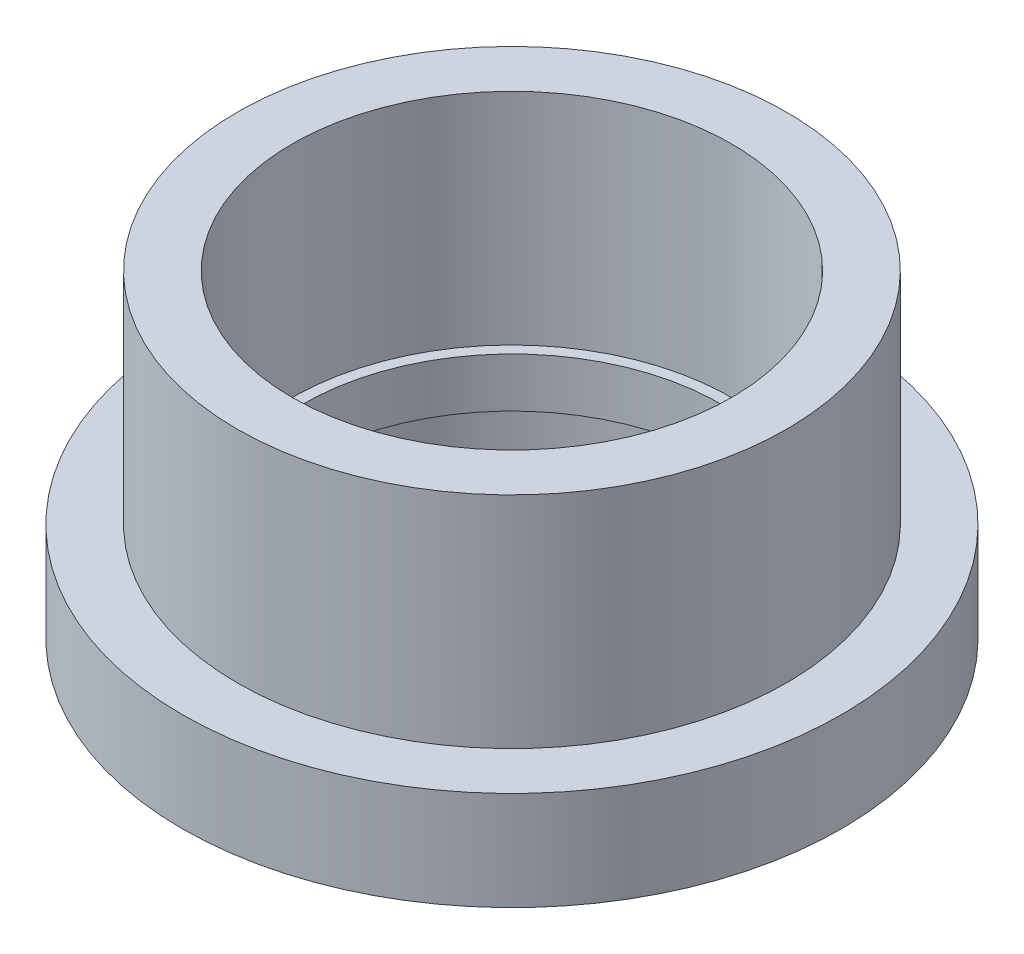
ISO-10303-21;
HEADER;
FILE_DESCRIPTION(('STEP AP214'),'2;1');
FILE_NAME('part.step','',(''),(''),'','','');
FILE_SCHEMA(('AUTOMOTIVE_DESIGN { 1 0 10303 214 1 1 1 1 }'));
ENDSEC;
DATA;
#1=APPLICATION_CONTEXT('core data for automotive mechanical design processes');
#2=APPLICATION_PROTOCOL_DEFINITION('international standard','automotive_design',2000,#1);
#3=PRODUCT_CONTEXT('',#1,'mechanical');
#4=PRODUCT('Part','Part','',(#3));
#5=PRODUCT_RELATED_PRODUCT_CATEGORY('part','',(#4));
#6=PRODUCT_DEFINITION_FORMATION('','',#4);
#7=PRODUCT_DEFINITION_CONTEXT('part definition',#1,'design');
#8=PRODUCT_DEFINITION('design','',#6,#7);
#9=PRODUCT_DEFINITION_SHAPE('','',#8);
#10=(LENGTH_UNIT() NAMED_UNIT(*) SI_UNIT(.MILLI.,.METRE.));
#11=(NAMED_UNIT(*) PLANE_ANGLE_UNIT() SI_UNIT($,.RADIAN.));
#12=(NAMED_UNIT(*) SI_UNIT($,.STERADIAN.) SOLID_ANGLE_UNIT());
#13=UNCERTAINTY_MEASURE_WITH_UNIT(LENGTH_MEASURE(1.E-05),#10,'distance_accuracy_value','');
#14=(GEOMETRIC_REPRESENTATION_CONTEXT(3) GLOBAL_UNCERTAINTY_ASSIGNED_CONTEXT((#13)) GLOBAL_UNIT_ASSIGNED_CONTEXT((#10,
#11,#12)) REPRESENTATION_CONTEXT('',''));
#15=CARTESIAN_POINT('',(0.,0.,0.));
#16=DIRECTION('',(0.,0.,1.));
#17=DIRECTION('',(1.,0.,0.));
#18=AXIS2_PLACEMENT_3D('',#15,#16,#17);
#19=CARTESIAN_POINT('',(38.,9.,0.));
#20=DIRECTION('',(0.,-1.,0.));
#21=DIRECTION('',(0.,0.,-1.));
#22=AXIS2_PLACEMENT_3D('',#19,#20,#21);
#23=PLANE('',#22);
#24=CARTESIAN_POINT('',(0.,8.99999999999999,0.));
#25=DIRECTION('',(0.,1.,0.));
#26=DIRECTION('',(0.,0.,1.));
#27=AXIS2_PLACEMENT_3D('',#24,#25,#26);
#28=CIRCLE('',#27,38.);
#29=CARTESIAN_POINT('',(0.,8.99999999999999,38.));
#30=VERTEX_POINT('',#29);
#31=EDGE_CURVE('E49',#30,#30,#28,.T.);
#32=ORIENTED_EDGE('',*,*,#31,.F.);
#33=EDGE_LOOP('',(#32));
#34=FACE_BOUND('',#33,.T.);
#35=CARTESIAN_POINT('',(0.,9.,0.));
#36=DIRECTION('',(0.,1.,0.));
#37=DIRECTION('',(0.,0.,1.));
#38=AXIS2_PLACEMENT_3D('',#35,#36,#37);
#39=CIRCLE('',#38,40.);
#40=CARTESIAN_POINT('',(0.,9.,40.));
#41=VERTEX_POINT('',#40);
#42=EDGE_CURVE('E100',#41,#41,#39,.T.);
#43=ORIENTED_EDGE('',*,*,#42,.T.);
#44=EDGE_LOOP('',(#43));
#45=FACE_BOUND('',#44,.T.);
#46=ADVANCED_FACE('F37',(#34,#45),#23,.F.);
#47=CARTESIAN_POINT('',(40.25,0.,0.));
#48=DIRECTION('',(0.,1.,0.));
#49=DIRECTION('',(0.,0.,1.));
#50=AXIS2_PLACEMENT_3D('',#47,#48,#49);
#51=PLANE('',#50);
#52=CARTESIAN_POINT('',(0.,0.,0.));
#53=DIRECTION('',(0.,1.,0.));
#54=DIRECTION('',(0.,0.,1.));
#55=AXIS2_PLACEMENT_3D('',#52,#53,#54);
#56=CIRCLE('',#55,40.25);
#57=CARTESIAN_POINT('',(0.,0.,40.25));
#58=VERTEX_POINT('',#57);
#59=EDGE_CURVE('E57',#58,#58,#56,.T.);
#60=ORIENTED_EDGE('',*,*,#59,.F.);
#61=EDGE_LOOP('',(#60));
#62=FACE_BOUND('',#61,.T.);
#63=CARTESIAN_POINT('',(0.,0.,0.));
#64=DIRECTION('',(0.,1.,0.));
#65=DIRECTION('',(0.,0.,1.));
#66=AXIS2_PLACEMENT_3D('',#63,#64,#65);
#67=CIRCLE('',#66,38.);
#68=CARTESIAN_POINT('',(0.,0.,38.));
#69=VERTEX_POINT('',#68);
#70=EDGE_CURVE('E41',#69,#69,#67,.T.);
#71=ORIENTED_EDGE('',*,*,#70,.T.);
#72=EDGE_LOOP('',(#71));
#73=FACE_BOUND('',#72,.T.);
#74=ADVANCED_FACE('F39',(#62,#73),#51,.F.);
#75=CARTESIAN_POINT('',(0.,83.5208362070746,0.));
#76=DIRECTION('',(0.,1.,0.));
#77=DIRECTION('',(0.,0.,1.));
#78=AXIS2_PLACEMENT_3D('',#75,#76,#77);
#79=CYLINDRICAL_SURFACE('',#78,38.);
#80=ORIENTED_EDGE('',*,*,#70,.F.);
#81=EDGE_LOOP('',(#80));
#82=FACE_BOUND('',#81,.T.);
#83=ORIENTED_EDGE('',*,*,#31,.T.);
#84=EDGE_LOOP('',(#83));
#85=FACE_BOUND('',#84,.T.);
#86=ADVANCED_FACE('F92',(#82,#85),#79,.F.);
#87=CARTESIAN_POINT('',(0.,9.,0.));
#88=DIRECTION('',(0.,1.,0.));
#89=DIRECTION('',(0.,0.,1.));
#90=AXIS2_PLACEMENT_3D('',#87,#88,#89);
#91=CIRCLE('',#90,50.);
#92=CARTESIAN_POINT('',(0.,9.,50.));
#93=VERTEX_POINT('',#92);
#94=EDGE_CURVE('E10',#93,#93,#91,.T.);
#95=ORIENTED_EDGE('',*,*,#94,.F.);
#96=EDGE_LOOP('',(#95));
#97=FACE_BOUND('',#96,.T.);
#98=CARTESIAN_POINT('',(0.,8.99999999999999,0.));
#99=DIRECTION('',(0.,1.,0.));
#100=DIRECTION('',(0.,0.,1.));
#101=AXIS2_PLACEMENT_3D('',#98,#99,#100);
#102=CIRCLE('',#101,60.);
#103=CARTESIAN_POINT('',(0.,8.99999999999999,60.));
#104=VERTEX_POINT('',#103);
#105=EDGE_CURVE('E87',#104,#104,#102,.T.);
#106=ORIENTED_EDGE('',*,*,#105,.T.);
#107=EDGE_LOOP('',(#106));
#108=FACE_BOUND('',#107,.T.);
#109=ADVANCED_FACE('F97',(#97,#108),#23,.F.);
#110=CARTESIAN_POINT('',(0.,83.5208362070746,0.));
#111=DIRECTION('',(0.,1.,0.));
#112=DIRECTION('',(0.,0.,1.));
#113=AXIS2_PLACEMENT_3D('',#110,#111,#112);
#114=CYLINDRICAL_SURFACE('',#113,60.);
#115=ORIENTED_EDGE('',*,*,#105,.F.);
#116=EDGE_LOOP('',(#115));
#117=FACE_BOUND('',#116,.T.);
#118=CARTESIAN_POINT('',(0.,-8.99999999999999,0.));
#119=DIRECTION('',(0.,1.,0.));
#120=DIRECTION('',(0.,0.,1.));
#121=AXIS2_PLACEMENT_3D('',#118,#119,#120);
#122=CIRCLE('',#121,60.);
#123=CARTESIAN_POINT('',(0.,-8.99999999999999,60.));
#124=VERTEX_POINT('',#123);
#125=EDGE_CURVE('E84',#124,#124,#122,.T.);
#126=ORIENTED_EDGE('',*,*,#125,.T.);
#127=EDGE_LOOP('',(#126));
#128=FACE_BOUND('',#127,.T.);
#129=ADVANCED_FACE('F163',(#117,#128),#114,.T.);
#130=CARTESIAN_POINT('',(60.,-9.,0.));
#131=DIRECTION('',(0.,1.,0.));
#132=DIRECTION('',(0.,0.,1.));
#133=AXIS2_PLACEMENT_3D('',#130,#131,#132);
#134=PLANE('',#133);
#135=CARTESIAN_POINT('',(0.,-9.,45.125));
#136=DIRECTION('',(0.,-1.,0.));
#137=DIRECTION('',(0.,0.,-1.));
#138=AXIS2_PLACEMENT_3D('',#135,#136,#137);
#139=CIRCLE('',#138,1.6);
#140=CARTESIAN_POINT('',(0.,-9.,43.525));
#141=VERTEX_POINT('',#140);
#142=EDGE_CURVE('E58',#141,#141,#139,.T.);
#143=ORIENTED_EDGE('',*,*,#142,.F.);
#144=EDGE_LOOP('',(#143));
#145=FACE_BOUND('',#144,.T.);
#146=CARTESIAN_POINT('',(45.125,-9.,-1.57553095415296E-13));
#147=DIRECTION('',(0.,-1.,0.));
#148=DIRECTION('',(0.,0.,-1.));
#149=AXIS2_PLACEMENT_3D('',#146,#147,#148);
#150=CIRCLE('',#149,1.6);
#151=CARTESIAN_POINT('',(45.125,-9.,-1.60000000000016));
#152=VERTEX_POINT('',#151);
#153=EDGE_CURVE('E61',#152,#152,#150,.T.);
#154=ORIENTED_EDGE('',*,*,#153,.F.);
#155=EDGE_LOOP('',(#154));
#156=FACE_BOUND('',#155,.T.);
#157=CARTESIAN_POINT('',(-3.15106190830593E-13,-9.,-45.125));
#158=DIRECTION('',(0.,-1.,0.));
#159=DIRECTION('',(0.,0.,-1.));
#160=AXIS2_PLACEMENT_3D('',#157,#158,#159);
#161=CIRCLE('',#160,1.6);
#162=CARTESIAN_POINT('',(-3.15106190830593E-13,-9.,-46.725));
#163=VERTEX_POINT('',#162);
#164=EDGE_CURVE('E67',#163,#163,#161,.T.);
#165=ORIENTED_EDGE('',*,*,#164,.F.);
#166=EDGE_LOOP('',(#165));
#167=FACE_BOUND('',#166,.T.);
#168=CARTESIAN_POINT('',(-45.125,-9.,4.72659286245889E-13));
#169=DIRECTION('',(0.,-1.,0.));
#170=DIRECTION('',(0.,0.,-1.));
#171=AXIS2_PLACEMENT_3D('',#168,#169,#170);
#172=CIRCLE('',#171,1.6);
#173=CARTESIAN_POINT('',(-45.125,-9.,-1.59999999999953));
#174=VERTEX_POINT('',#173);
#175=EDGE_CURVE('E73',#174,#174,#172,.T.);
#176=ORIENTED_EDGE('',*,*,#175,.F.);
#177=EDGE_LOOP('',(#176));
#178=FACE_BOUND('',#177,.T.);
#179=ORIENTED_EDGE('',*,*,#125,.F.);
#180=EDGE_LOOP('',(#179));
#181=FACE_BOUND('',#180,.T.);
#182=CARTESIAN_POINT('',(0.,-8.99999999999999,0.));
#183=DIRECTION('',(0.,1.,0.));
#184=DIRECTION('',(0.,0.,1.));
#185=AXIS2_PLACEMENT_3D('',#182,#183,#184);
#186=CIRCLE('',#185,40.25);
#187=CARTESIAN_POINT('',(0.,-8.99999999999999,40.25));
#188=VERTEX_POINT('',#187);
#189=EDGE_CURVE('E81',#188,#188,#186,.T.);
#190=ORIENTED_EDGE('',*,*,#189,.T.);
#191=EDGE_LOOP('',(#190));
#192=FACE_BOUND('',#191,.T.);
#193=ADVANCED_FACE('F159',(#145,#156,#167,#178,#181,#192),#134,.F.);
#194=CARTESIAN_POINT('',(0.,83.5208362070746,0.));
#195=DIRECTION('',(0.,1.,0.));
#196=DIRECTION('',(0.,0.,1.));
#197=AXIS2_PLACEMENT_3D('',#194,#195,#196);
#198=CYLINDRICAL_SURFACE('',#197,40.25);
#199=ORIENTED_EDGE('',*,*,#189,.F.);
#200=EDGE_LOOP('',(#199));
#201=FACE_BOUND('',#200,.T.);
#202=ORIENTED_EDGE('',*,*,#59,.T.);
#203=EDGE_LOOP('',(#202));
#204=FACE_BOUND('',#203,.T.);
#205=ADVANCED_FACE('F152',(#201,#204),#198,.F.);
#206=CARTESIAN_POINT('',(-45.125,1.,4.72659286245889E-13));
#207=DIRECTION('',(0.,-1.,0.));
#208=DIRECTION('',(0.,0.,-1.));
#209=AXIS2_PLACEMENT_3D('',#206,#207,#208);
#210=CYLINDRICAL_SURFACE('',#209,1.6);
#211=CARTESIAN_POINT('',(-45.125,1.,4.72659286245889E-13));
#212=DIRECTION('',(0.,-1.,0.));
#213=DIRECTION('',(0.,0.,-1.));
#214=AXIS2_PLACEMENT_3D('',#211,#212,#213);
#215=CIRCLE('',#214,1.6);
#216=CARTESIAN_POINT('',(-45.125,1.,-1.59999999999953));
#217=VERTEX_POINT('',#216);
#218=EDGE_CURVE('E76',#217,#217,#215,.T.);
#219=ORIENTED_EDGE('',*,*,#218,.F.);
#220=EDGE_LOOP('',(#219));
#221=FACE_BOUND('',#220,.T.);
#222=ORIENTED_EDGE('',*,*,#175,.T.);
#223=EDGE_LOOP('',(#222));
#224=FACE_BOUND('',#223,.T.);
#225=ADVANCED_FACE('F149',(#221,#224),#210,.F.);
#226=CARTESIAN_POINT('',(-45.125,1.,4.72659286245889E-13));
#227=DIRECTION('',(0.,-1.,0.));
#228=DIRECTION('',(0.,0.,-1.));
#229=AXIS2_PLACEMENT_3D('',#226,#227,#228);
#230=PLANE('',#229);
#231=ORIENTED_EDGE('',*,*,#218,.T.);
#232=EDGE_LOOP('',(#231));
#233=FACE_BOUND('',#232,.T.);
#234=ADVANCED_FACE('F144',(#233),#230,.T.);
#235=CARTESIAN_POINT('',(-3.15106190830593E-13,1.,-45.125));
#236=DIRECTION('',(0.,-1.,0.));
#237=DIRECTION('',(0.,0.,-1.));
#238=AXIS2_PLACEMENT_3D('',#235,#236,#237);
#239=CYLINDRICAL_SURFACE('',#238,1.6);
#240=CARTESIAN_POINT('',(-3.15106190830593E-13,1.,-45.125));
#241=DIRECTION('',(0.,-1.,0.));
#242=DIRECTION('',(0.,0.,-1.));
#243=AXIS2_PLACEMENT_3D('',#240,#241,#242);
#244=CIRCLE('',#243,1.6);
#245=CARTESIAN_POINT('',(-3.15106190830593E-13,1.,-46.725));
#246=VERTEX_POINT('',#245);
#247=EDGE_CURVE('E70',#246,#246,#244,.T.);
#248=ORIENTED_EDGE('',*,*,#247,.F.);
#249=EDGE_LOOP('',(#248));
#250=FACE_BOUND('',#249,.T.);
#251=ORIENTED_EDGE('',*,*,#164,.T.);
#252=EDGE_LOOP('',(#251));
#253=FACE_BOUND('',#252,.T.);
#254=ADVANCED_FACE('F141',(#250,#253),#239,.F.);
#255=CARTESIAN_POINT('',(-3.15106190830593E-13,1.,-45.125));
#256=DIRECTION('',(0.,-1.,0.));
#257=DIRECTION('',(0.,0.,-1.));
#258=AXIS2_PLACEMENT_3D('',#255,#256,#257);
#259=PLANE('',#258);
#260=ORIENTED_EDGE('',*,*,#247,.T.);
#261=EDGE_LOOP('',(#260));
#262=FACE_BOUND('',#261,.T.);
#263=ADVANCED_FACE('F136',(#262),#259,.T.);
#264=CARTESIAN_POINT('',(45.125,1.,-1.57553095415296E-13));
#265=DIRECTION('',(0.,-1.,0.));
#266=DIRECTION('',(0.,0.,-1.));
#267=AXIS2_PLACEMENT_3D('',#264,#265,#266);
#268=CYLINDRICAL_SURFACE('',#267,1.6);
#269=CARTESIAN_POINT('',(45.125,1.,-1.57553095415296E-13));
#270=DIRECTION('',(0.,-1.,0.));
#271=DIRECTION('',(0.,0.,-1.));
#272=AXIS2_PLACEMENT_3D('',#269,#270,#271);
#273=CIRCLE('',#272,1.6);
#274=CARTESIAN_POINT('',(45.125,1.,-1.60000000000016));
#275=VERTEX_POINT('',#274);
#276=EDGE_CURVE('E64',#275,#275,#273,.T.);
#277=ORIENTED_EDGE('',*,*,#276,.F.);
#278=EDGE_LOOP('',(#277));
#279=FACE_BOUND('',#278,.T.);
#280=ORIENTED_EDGE('',*,*,#153,.T.);
#281=EDGE_LOOP('',(#280));
#282=FACE_BOUND('',#281,.T.);
#283=ADVANCED_FACE('F133',(#279,#282),#268,.F.);
#284=CARTESIAN_POINT('',(45.125,1.,-1.57553095415296E-13));
#285=DIRECTION('',(0.,-1.,0.));
#286=DIRECTION('',(0.,0.,-1.));
#287=AXIS2_PLACEMENT_3D('',#284,#285,#286);
#288=PLANE('',#287);
#289=ORIENTED_EDGE('',*,*,#276,.T.);
#290=EDGE_LOOP('',(#289));
#291=FACE_BOUND('',#290,.T.);
#292=ADVANCED_FACE('F131',(#291),#288,.T.);
#293=CARTESIAN_POINT('',(0.,1.,45.125));
#294=DIRECTION('',(0.,-1.,0.));
#295=DIRECTION('',(0.,0.,-1.));
#296=AXIS2_PLACEMENT_3D('',#293,#294,#295);
#297=CYLINDRICAL_SURFACE('',#296,1.6);
#298=CARTESIAN_POINT('',(0.,1.,45.125));
#299=DIRECTION('',(0.,-1.,0.));
#300=DIRECTION('',(0.,0.,-1.));
#301=AXIS2_PLACEMENT_3D('',#298,#299,#300);
#302=CIRCLE('',#301,1.6);
#303=CARTESIAN_POINT('',(0.,1.,43.525));
#304=VERTEX_POINT('',#303);
#305=EDGE_CURVE('E54',#304,#304,#302,.T.);
#306=ORIENTED_EDGE('',*,*,#305,.F.);
#307=EDGE_LOOP('',(#306));
#308=FACE_BOUND('',#307,.T.);
#309=ORIENTED_EDGE('',*,*,#142,.T.);
#310=EDGE_LOOP('',(#309));
#311=FACE_BOUND('',#310,.T.);
#312=ADVANCED_FACE('F127',(#308,#311),#297,.F.);
#313=CARTESIAN_POINT('',(0.,1.,45.125));
#314=DIRECTION('',(0.,-1.,0.));
#315=DIRECTION('',(0.,0.,-1.));
#316=AXIS2_PLACEMENT_3D('',#313,#314,#315);
#317=PLANE('',#316);
#318=ORIENTED_EDGE('',*,*,#305,.T.);
#319=EDGE_LOOP('',(#318));
#320=FACE_BOUND('',#319,.T.);
#321=ADVANCED_FACE('F122',(#320),#317,.T.);
#322=CARTESIAN_POINT('',(0.,49.,0.));
#323=DIRECTION('',(0.,1.,0.));
#324=DIRECTION('',(0.,0.,1.));
#325=AXIS2_PLACEMENT_3D('',#322,#323,#324);
#326=PLANE('',#325);
#327=CARTESIAN_POINT('',(0.,49.,0.));
#328=DIRECTION('',(0.,1.,0.));
#329=DIRECTION('',(0.,0.,1.));
#330=AXIS2_PLACEMENT_3D('',#327,#328,#329);
#331=CIRCLE('',#330,50.);
#332=CARTESIAN_POINT('',(0.,49.,50.));
#333=VERTEX_POINT('',#332);
#334=EDGE_CURVE('E52',#333,#333,#331,.T.);
#335=ORIENTED_EDGE('',*,*,#334,.T.);
#336=EDGE_LOOP('',(#335));
#337=FACE_BOUND('',#336,.T.);
#338=CARTESIAN_POINT('',(0.,49.,0.));
#339=DIRECTION('',(0.,1.,0.));
#340=DIRECTION('',(0.,0.,1.));
#341=AXIS2_PLACEMENT_3D('',#338,#339,#340);
#342=CIRCLE('',#341,40.);
#343=CARTESIAN_POINT('',(0.,49.,40.));
#344=VERTEX_POINT('',#343);
#345=EDGE_CURVE('E102',#344,#344,#342,.T.);
#346=ORIENTED_EDGE('',*,*,#345,.F.);
#347=EDGE_LOOP('',(#346));
#348=FACE_BOUND('',#347,.T.);
#349=ADVANCED_FACE('F110',(#337,#348),#326,.T.);
#350=CARTESIAN_POINT('',(0.,49.,0.));
#351=DIRECTION('',(0.,-1.,0.));
#352=DIRECTION('',(0.,0.,-1.));
#353=AXIS2_PLACEMENT_3D('',#350,#351,#352);
#354=CYLINDRICAL_SURFACE('',#353,50.);
#355=ORIENTED_EDGE('',*,*,#334,.F.);
#356=EDGE_LOOP('',(#355));
#357=FACE_BOUND('',#356,.T.);
#358=ORIENTED_EDGE('',*,*,#94,.T.);
#359=EDGE_LOOP('',(#358));
#360=FACE_BOUND('',#359,.T.);
#361=ADVANCED_FACE('F113',(#357,#360),#354,.T.);
#362=CARTESIAN_POINT('',(0.,49.,0.));
#363=DIRECTION('',(0.,-1.,0.));
#364=DIRECTION('',(0.,0.,-1.));
#365=AXIS2_PLACEMENT_3D('',#362,#363,#364);
#366=CYLINDRICAL_SURFACE('',#365,40.);
#367=ORIENTED_EDGE('',*,*,#345,.T.);
#368=EDGE_LOOP('',(#367));
#369=FACE_BOUND('',#368,.T.);
#370=ORIENTED_EDGE('',*,*,#42,.F.);
#371=EDGE_LOOP('',(#370));
#372=FACE_BOUND('',#371,.T.);
#373=ADVANCED_FACE('F115',(#369,#372),#366,.F.);
#374=CLOSED_SHELL('',(#46,#74,#86,#109,#129,#193,#205,#225,#234,#254,#263,#283,#292,#312,#321,
#349,#361,#373));
#375=MANIFOLD_SOLID_BREP('B2',#374);
#376=ADVANCED_BREP_SHAPE_REPRESENTATION('',(#18,#375),#14);
#377=SHAPE_DEFINITION_REPRESENTATION(#9,#376);
ENDSEC;
END-ISO-10303-21;
